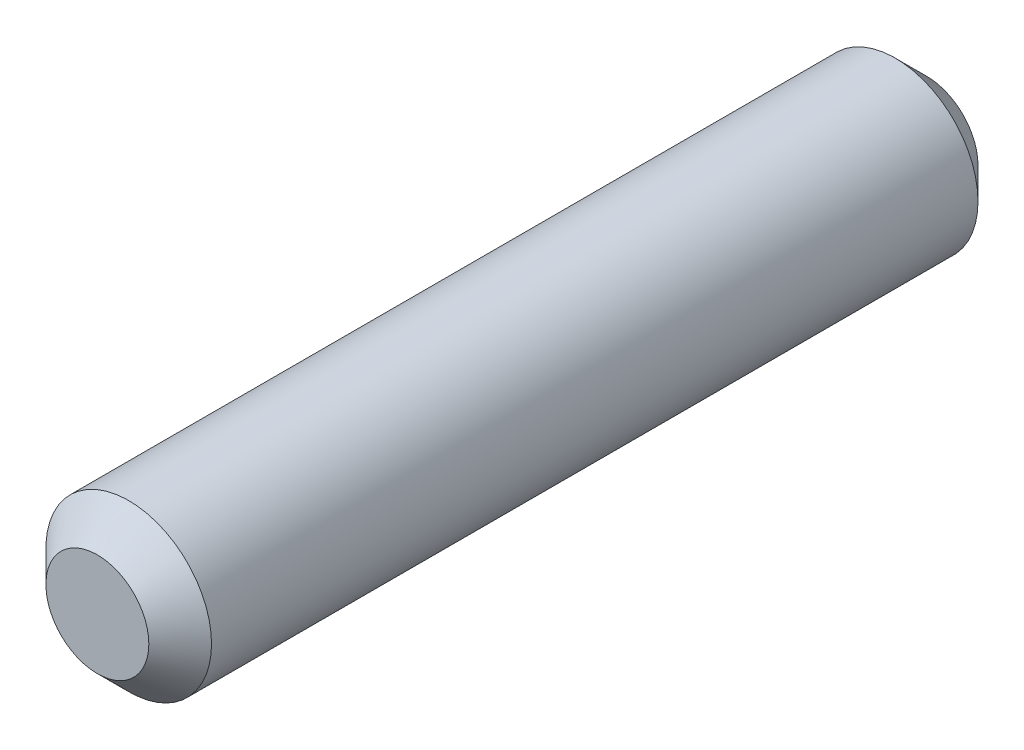
ISO-10303-21;
HEADER;
FILE_DESCRIPTION(('STEP AP214'),'2;1');
FILE_NAME('part.step','',(''),(''),'','','');
FILE_SCHEMA(('AUTOMOTIVE_DESIGN { 1 0 10303 214 1 1 1 1 }'));
ENDSEC;
DATA;
#1=APPLICATION_CONTEXT('core data for automotive mechanical design processes');
#2=APPLICATION_PROTOCOL_DEFINITION('international standard','automotive_design',2000,#1);
#3=PRODUCT_CONTEXT('',#1,'mechanical');
#4=PRODUCT('Part','Part','',(#3));
#5=PRODUCT_RELATED_PRODUCT_CATEGORY('part','',(#4));
#6=PRODUCT_DEFINITION_FORMATION('','',#4);
#7=PRODUCT_DEFINITION_CONTEXT('part definition',#1,'design');
#8=PRODUCT_DEFINITION('design','',#6,#7);
#9=PRODUCT_DEFINITION_SHAPE('','',#8);
#10=(LENGTH_UNIT() NAMED_UNIT(*) SI_UNIT(.MILLI.,.METRE.));
#11=(NAMED_UNIT(*) PLANE_ANGLE_UNIT() SI_UNIT($,.RADIAN.));
#12=(NAMED_UNIT(*) SI_UNIT($,.STERADIAN.) SOLID_ANGLE_UNIT());
#13=UNCERTAINTY_MEASURE_WITH_UNIT(LENGTH_MEASURE(1.E-05),#10,'distance_accuracy_value','');
#14=(GEOMETRIC_REPRESENTATION_CONTEXT(3) GLOBAL_UNCERTAINTY_ASSIGNED_CONTEXT((#13)) GLOBAL_UNIT_ASSIGNED_CONTEXT((#10,
#11,#12)) REPRESENTATION_CONTEXT('',''));
#15=CARTESIAN_POINT('',(0.,0.,0.));
#16=DIRECTION('',(0.,0.,1.));
#17=DIRECTION('',(1.,0.,0.));
#18=AXIS2_PLACEMENT_3D('',#15,#16,#17);
#19=CARTESIAN_POINT('',(0.,0.,7.935));
#20=DIRECTION('',(0.,0.,-1.));
#21=DIRECTION('',(-1.,0.,0.));
#22=AXIS2_PLACEMENT_3D('',#19,#20,#21);
#23=CYLINDRICAL_SURFACE('',#22,1.585);
#24=CARTESIAN_POINT('',(0.,0.,-7.335));
#25=DIRECTION('',(0.,0.,1.));
#26=DIRECTION('',(1.,0.,0.));
#27=AXIS2_PLACEMENT_3D('',#24,#25,#26);
#28=CIRCLE('',#27,1.585);
#29=CARTESIAN_POINT('',(1.585,0.,-7.335));
#30=VERTEX_POINT('',#29);
#31=EDGE_CURVE('E45',#30,#30,#28,.T.);
#32=ORIENTED_EDGE('',*,*,#31,.T.);
#33=EDGE_LOOP('',(#32));
#34=FACE_BOUND('',#33,.T.);
#35=CARTESIAN_POINT('',(0.,0.,7.335));
#36=DIRECTION('',(0.,0.,1.));
#37=DIRECTION('',(1.,0.,0.));
#38=AXIS2_PLACEMENT_3D('',#35,#36,#37);
#39=CIRCLE('',#38,1.585);
#40=CARTESIAN_POINT('',(1.585,0.,7.335));
#41=VERTEX_POINT('',#40);
#42=EDGE_CURVE('E49',#41,#41,#39,.F.);
#43=ORIENTED_EDGE('',*,*,#42,.T.);
#44=EDGE_LOOP('',(#43));
#45=FACE_BOUND('',#44,.T.);
#46=ADVANCED_FACE('F33',(#34,#45),#23,.T.);
#47=CARTESIAN_POINT('',(0.,0.,7.935));
#48=DIRECTION('',(0.,0.,1.));
#49=DIRECTION('',(1.,0.,0.));
#50=AXIS2_PLACEMENT_3D('',#47,#48,#49);
#51=PLANE('',#50);
#52=CARTESIAN_POINT('',(0.,0.,7.935));
#53=DIRECTION('',(0.,0.,1.));
#54=DIRECTION('',(1.,0.,0.));
#55=AXIS2_PLACEMENT_3D('',#52,#53,#54);
#56=CIRCLE('',#55,0.984999999999998);
#57=CARTESIAN_POINT('',(0.984999999999998,0.,7.935));
#58=VERTEX_POINT('',#57);
#59=EDGE_CURVE('E10',#58,#58,#56,.T.);
#60=ORIENTED_EDGE('',*,*,#59,.T.);
#61=EDGE_LOOP('',(#60));
#62=FACE_BOUND('',#61,.T.);
#63=ADVANCED_FACE('F65',(#62),#51,.T.);
#64=CARTESIAN_POINT('',(0.,0.,-7.935));
#65=DIRECTION('',(0.,0.,1.));
#66=DIRECTION('',(1.,0.,0.));
#67=AXIS2_PLACEMENT_3D('',#64,#65,#66);
#68=PLANE('',#67);
#69=CARTESIAN_POINT('',(0.,0.,-7.935));
#70=DIRECTION('',(0.,0.,1.));
#71=DIRECTION('',(1.,0.,0.));
#72=AXIS2_PLACEMENT_3D('',#69,#70,#71);
#73=CIRCLE('',#72,0.984999999999998);
#74=CARTESIAN_POINT('',(0.984999999999997,0.,-7.935));
#75=VERTEX_POINT('',#74);
#76=EDGE_CURVE('E41',#75,#75,#73,.F.);
#77=ORIENTED_EDGE('',*,*,#76,.T.);
#78=EDGE_LOOP('',(#77));
#79=FACE_BOUND('',#78,.T.);
#80=ADVANCED_FACE('F62',(#79),#68,.F.);
#81=CARTESIAN_POINT('',(0.,0.,-7.335));
#82=DIRECTION('',(0.,0.,1.));
#83=DIRECTION('',(1.,0.,0.));
#84=AXIS2_PLACEMENT_3D('',#81,#82,#83);
#85=CONICAL_SURFACE('',#84,1.585,0.785398163397449);
#86=CARTESIAN_POINT('',(0.984999999999997,0.,-7.935));
#87=CARTESIAN_POINT('',(0.991249999999997,0.,-7.92875));
#88=CARTESIAN_POINT('',(0.997499999999997,0.,-7.9225));
#89=CARTESIAN_POINT('',(1.01,0.,-7.91));
#90=CARTESIAN_POINT('',(1.01625,0.,-7.90375));
#91=CARTESIAN_POINT('',(1.02875,0.,-7.89125));
#92=CARTESIAN_POINT('',(1.035,0.,-7.885));
#93=CARTESIAN_POINT('',(1.0475,0.,-7.8725));
#94=CARTESIAN_POINT('',(1.05375,0.,-7.86625));
#95=CARTESIAN_POINT('',(1.06625,0.,-7.85375));
#96=CARTESIAN_POINT('',(1.0725,0.,-7.8475));
#97=CARTESIAN_POINT('',(1.085,0.,-7.835));
#98=CARTESIAN_POINT('',(1.09125,0.,-7.82875));
#99=CARTESIAN_POINT('',(1.10375,0.,-7.81625));
#100=CARTESIAN_POINT('',(1.11,0.,-7.81));
#101=CARTESIAN_POINT('',(1.1225,0.,-7.7975));
#102=CARTESIAN_POINT('',(1.12875,0.,-7.79125));
#103=CARTESIAN_POINT('',(1.14125,0.,-7.77875));
#104=CARTESIAN_POINT('',(1.1475,0.,-7.7725));
#105=CARTESIAN_POINT('',(1.16,0.,-7.76));
#106=CARTESIAN_POINT('',(1.16625,0.,-7.75375));
#107=CARTESIAN_POINT('',(1.17875,0.,-7.74125));
#108=CARTESIAN_POINT('',(1.185,0.,-7.735));
#109=CARTESIAN_POINT('',(1.1975,0.,-7.7225));
#110=CARTESIAN_POINT('',(1.20375,0.,-7.71625));
#111=CARTESIAN_POINT('',(1.21625,0.,-7.70375));
#112=CARTESIAN_POINT('',(1.2225,0.,-7.6975));
#113=CARTESIAN_POINT('',(1.235,0.,-7.685));
#114=CARTESIAN_POINT('',(1.24125,0.,-7.67875));
#115=CARTESIAN_POINT('',(1.25375,0.,-7.66625));
#116=CARTESIAN_POINT('',(1.26,0.,-7.66));
#117=CARTESIAN_POINT('',(1.2725,0.,-7.6475));
#118=CARTESIAN_POINT('',(1.27875,0.,-7.64125));
#119=CARTESIAN_POINT('',(1.29125,0.,-7.62875));
#120=CARTESIAN_POINT('',(1.2975,0.,-7.6225));
#121=CARTESIAN_POINT('',(1.31,0.,-7.61));
#122=CARTESIAN_POINT('',(1.31625,0.,-7.60375));
#123=CARTESIAN_POINT('',(1.32875,0.,-7.59125));
#124=CARTESIAN_POINT('',(1.335,0.,-7.585));
#125=CARTESIAN_POINT('',(1.3475,0.,-7.5725));
#126=CARTESIAN_POINT('',(1.35375,0.,-7.56625));
#127=CARTESIAN_POINT('',(1.36625,0.,-7.55375));
#128=CARTESIAN_POINT('',(1.3725,0.,-7.5475));
#129=CARTESIAN_POINT('',(1.385,0.,-7.535));
#130=CARTESIAN_POINT('',(1.39125,0.,-7.52875));
#131=CARTESIAN_POINT('',(1.40375,0.,-7.51625));
#132=CARTESIAN_POINT('',(1.41,0.,-7.51));
#133=CARTESIAN_POINT('',(1.4225,0.,-7.4975));
#134=CARTESIAN_POINT('',(1.42875,0.,-7.49125));
#135=CARTESIAN_POINT('',(1.44125,0.,-7.47875));
#136=CARTESIAN_POINT('',(1.4475,0.,-7.4725));
#137=CARTESIAN_POINT('',(1.46,0.,-7.46));
#138=CARTESIAN_POINT('',(1.46625,0.,-7.45375));
#139=CARTESIAN_POINT('',(1.47875,0.,-7.44125));
#140=CARTESIAN_POINT('',(1.485,0.,-7.435));
#141=CARTESIAN_POINT('',(1.4975,0.,-7.4225));
#142=CARTESIAN_POINT('',(1.50375,0.,-7.41625));
#143=CARTESIAN_POINT('',(1.51625,0.,-7.40375));
#144=CARTESIAN_POINT('',(1.5225,0.,-7.3975));
#145=CARTESIAN_POINT('',(1.535,0.,-7.385));
#146=CARTESIAN_POINT('',(1.54125,0.,-7.37875));
#147=CARTESIAN_POINT('',(1.55375,0.,-7.36625));
#148=CARTESIAN_POINT('',(1.56,0.,-7.36));
#149=CARTESIAN_POINT('',(1.5725,0.,-7.3475));
#150=CARTESIAN_POINT('',(1.57875,0.,-7.34125));
#151=CARTESIAN_POINT('',(1.585,0.,-7.335));
#152=B_SPLINE_CURVE_WITH_KNOTS('',3,(#86,#87,#88,#89,#90,#91,#92,#93,#94,#95,#96,#97,#98,#99,
#100,#101,#102,#103,#104,#105,#106,#107,#108,#109,#110,#111,#112,#113,#114,#115,#116,#117,#118,
#119,#120,#121,#122,#123,#124,#125,#126,#127,#128,#129,#130,#131,#132,#133,#134,#135,#136,#137,
#138,#139,#140,#141,#142,#143,#144,#145,#146,#147,#148,#149,#150,#151),.UNSPECIFIED.,.F.,.F.,(4,
2,2,2,2,2,2,2,2,2,2,2,2,2,2,2,2,2,2,2,2,2,2,2,2,2,2,2,2,2,2,2,4),(0.,0.0265165042944954,
0.0530330085889906,0.0795495128834861,0.106066017177981,0.132582521472478,0.159099025766973,
0.185615530061469,0.212132034355965,0.23864853865046,0.265165042944956,0.291681547239451,
0.318198051533947,0.344714555828443,0.371231060122938,0.397747564417434,0.424264068711929,
0.450780573006425,0.477297077300921,0.503813581595417,0.530330085889912,0.556846590184408,
0.583363094478903,0.609879598773399,0.636396103067895,0.66291260736239,0.689429111656886,
0.715945615951381,0.742462120245877,0.768978624540373,0.795495128834869,0.822011633129364,
0.84852813742386),.UNSPECIFIED.);
#153=EDGE_CURVE('BSEAM58',#75,#30,#152,.T.);
#154=ORIENTED_EDGE('',*,*,#76,.F.);
#155=ORIENTED_EDGE('',*,*,#31,.F.);
#156=ORIENTED_EDGE('',*,*,#153,.T.);
#157=ORIENTED_EDGE('',*,*,#153,.F.);
#158=EDGE_LOOP('',(#154,#156,#155,#157));
#159=FACE_BOUND('',#158,.T.);
#160=ADVANCED_FACE('F58',(#159),#85,.T.);
#161=CARTESIAN_POINT('',(0.,0.,7.935));
#162=DIRECTION('',(0.,0.,-1.));
#163=DIRECTION('',(-1.,0.,0.));
#164=AXIS2_PLACEMENT_3D('',#161,#162,#163);
#165=CONICAL_SURFACE('',#164,0.984999999999998,0.785398163397448);
#166=ORIENTED_EDGE('',*,*,#42,.F.);
#167=EDGE_LOOP('',(#166));
#168=FACE_BOUND('',#167,.T.);
#169=ORIENTED_EDGE('',*,*,#59,.F.);
#170=EDGE_LOOP('',(#169));
#171=FACE_BOUND('',#170,.T.);
#172=ADVANCED_FACE('F36',(#168,#171),#165,.T.);
#173=CLOSED_SHELL('',(#46,#63,#80,#160,#172));
#174=MANIFOLD_SOLID_BREP('B2',#173);
#175=ADVANCED_BREP_SHAPE_REPRESENTATION('',(#18,#174),#14);
#176=SHAPE_DEFINITION_REPRESENTATION(#9,#175);
ENDSEC;
END-ISO-10303-21;
